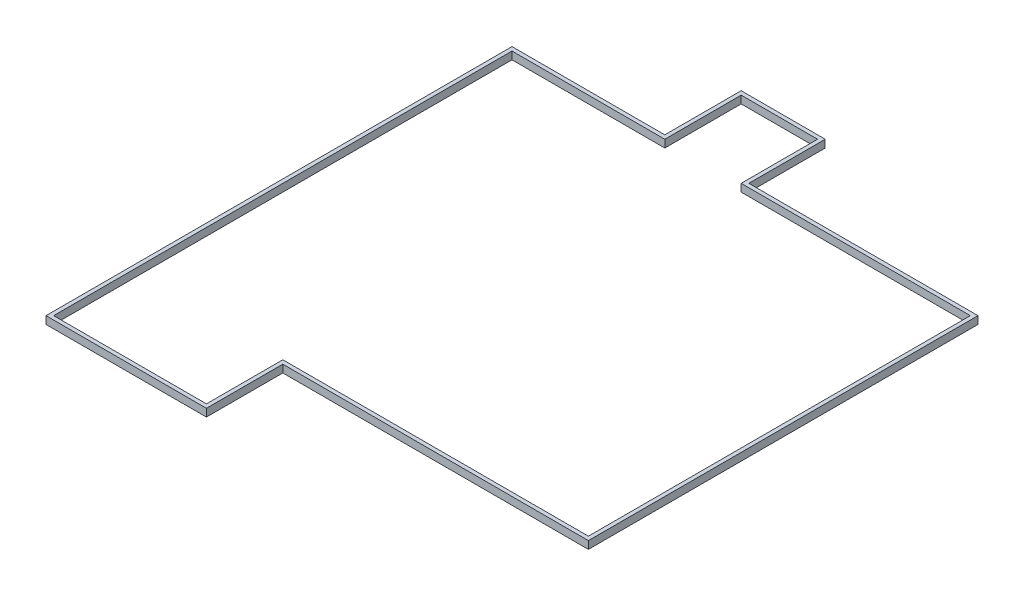
ISO-10303-21;
HEADER;
FILE_DESCRIPTION(('STEP AP214'),'2;1');
FILE_NAME('part.step','',(''),(''),'','','');
FILE_SCHEMA(('AUTOMOTIVE_DESIGN { 1 0 10303 214 1 1 1 1 }'));
ENDSEC;
DATA;
#1=APPLICATION_CONTEXT('core data for automotive mechanical design processes');
#2=APPLICATION_PROTOCOL_DEFINITION('international standard','automotive_design',2000,#1);
#3=PRODUCT_CONTEXT('',#1,'mechanical');
#4=PRODUCT('Part','Part','',(#3));
#5=PRODUCT_RELATED_PRODUCT_CATEGORY('part','',(#4));
#6=PRODUCT_DEFINITION_FORMATION('','',#4);
#7=PRODUCT_DEFINITION_CONTEXT('part definition',#1,'design');
#8=PRODUCT_DEFINITION('design','',#6,#7);
#9=PRODUCT_DEFINITION_SHAPE('','',#8);
#10=(LENGTH_UNIT() NAMED_UNIT(*) SI_UNIT(.MILLI.,.METRE.));
#11=(NAMED_UNIT(*) PLANE_ANGLE_UNIT() SI_UNIT($,.RADIAN.));
#12=(NAMED_UNIT(*) SI_UNIT($,.STERADIAN.) SOLID_ANGLE_UNIT());
#13=UNCERTAINTY_MEASURE_WITH_UNIT(LENGTH_MEASURE(1.E-05),#10,'distance_accuracy_value','');
#14=(GEOMETRIC_REPRESENTATION_CONTEXT(3) GLOBAL_UNCERTAINTY_ASSIGNED_CONTEXT((#13)) GLOBAL_UNIT_ASSIGNED_CONTEXT((#10,
#11,#12)) REPRESENTATION_CONTEXT('',''));
#15=CARTESIAN_POINT('',(0.,0.,0.));
#16=DIRECTION('',(0.,0.,1.));
#17=DIRECTION('',(1.,0.,0.));
#18=AXIS2_PLACEMENT_3D('',#15,#16,#17);
#19=CARTESIAN_POINT('',(0.,80.,0.));
#20=DIRECTION('',(0.,-1.,0.));
#21=DIRECTION('',(0.,0.,-1.));
#22=AXIS2_PLACEMENT_3D('',#19,#20,#21);
#23=PLANE('',#22);
#24=DIRECTION('',(0.,0.,1.));
#25=VECTOR('',#24,1.);
#26=CARTESIAN_POINT('',(-839.999999999999,80.,-3640.));
#27=LINE('',#26,#25);
#28=CARTESIAN_POINT('',(-839.999999999999,80.,-3640.));
#29=VERTEX_POINT('',#28);
#30=CARTESIAN_POINT('',(-839.999999999999,80.,-2840.));
#31=VERTEX_POINT('',#30);
#32=EDGE_CURVE('E252',#29,#31,#27,.T.);
#33=ORIENTED_EDGE('',*,*,#32,.T.);
#34=DIRECTION('',(-1.,0.,0.));
#35=VECTOR('',#34,1.);
#36=CARTESIAN_POINT('',(-839.999999999999,80.,-2840.));
#37=LINE('',#36,#35);
#38=CARTESIAN_POINT('',(-2440.,80.,-2840.));
#39=VERTEX_POINT('',#38);
#40=EDGE_CURVE('E255',#31,#39,#37,.T.);
#41=ORIENTED_EDGE('',*,*,#40,.T.);
#42=DIRECTION('',(0.,0.,1.));
#43=VECTOR('',#42,1.);
#44=CARTESIAN_POINT('',(-2440.,80.,-2840.));
#45=LINE('',#44,#43);
#46=CARTESIAN_POINT('',(-2440.,80.,2040.));
#47=VERTEX_POINT('',#46);
#48=EDGE_CURVE('E258',#39,#47,#45,.T.);
#49=ORIENTED_EDGE('',*,*,#48,.T.);
#50=DIRECTION('',(1.,0.,0.));
#51=VECTOR('',#50,1.);
#52=CARTESIAN_POINT('',(-2440.,80.,2040.));
#53=LINE('',#52,#51);
#54=CARTESIAN_POINT('',(-759.999999999999,80.,2040.));
#55=VERTEX_POINT('',#54);
#56=EDGE_CURVE('E260',#47,#55,#53,.T.);
#57=ORIENTED_EDGE('',*,*,#56,.T.);
#58=DIRECTION('',(0.,0.,-1.));
#59=VECTOR('',#58,1.);
#60=CARTESIAN_POINT('',(-759.999999999999,80.,1240.));
#61=LINE('',#60,#59);
#62=CARTESIAN_POINT('',(-759.999999999999,80.,1240.));
#63=VERTEX_POINT('',#62);
#64=EDGE_CURVE('E262',#55,#63,#61,.T.);
#65=ORIENTED_EDGE('',*,*,#64,.T.);
#66=DIRECTION('',(1.,0.,0.));
#67=VECTOR('',#66,1.);
#68=CARTESIAN_POINT('',(-759.999999999999,80.,1240.));
#69=LINE('',#68,#67);
#70=CARTESIAN_POINT('',(2440.00000000003,80.,1240.));
#71=VERTEX_POINT('',#70);
#72=EDGE_CURVE('E264',#63,#71,#69,.T.);
#73=ORIENTED_EDGE('',*,*,#72,.T.);
#74=DIRECTION('',(0.,0.,-1.));
#75=VECTOR('',#74,1.);
#76=CARTESIAN_POINT('',(2440.00000000003,80.,1240.));
#77=LINE('',#76,#75);
#78=CARTESIAN_POINT('',(2440.00000000003,80.,-2840.));
#79=VERTEX_POINT('',#78);
#80=EDGE_CURVE('E266',#71,#79,#77,.T.);
#81=ORIENTED_EDGE('',*,*,#80,.T.);
#82=DIRECTION('',(-1.,0.,0.));
#83=VECTOR('',#82,1.);
#84=CARTESIAN_POINT('',(2440.00000000003,80.,-2840.));
#85=LINE('',#84,#83);
#86=CARTESIAN_POINT('',(40.,80.,-2840.));
#87=VERTEX_POINT('',#86);
#88=EDGE_CURVE('E268',#79,#87,#85,.T.);
#89=ORIENTED_EDGE('',*,*,#88,.T.);
#90=DIRECTION('',(0.,0.,-1.));
#91=VECTOR('',#90,1.);
#92=CARTESIAN_POINT('',(40.,80.,-2840.));
#93=LINE('',#92,#91);
#94=CARTESIAN_POINT('',(40.,80.,-3640.));
#95=VERTEX_POINT('',#94);
#96=EDGE_CURVE('E270',#87,#95,#93,.T.);
#97=ORIENTED_EDGE('',*,*,#96,.T.);
#98=DIRECTION('',(-1.,0.,0.));
#99=VECTOR('',#98,1.);
#100=CARTESIAN_POINT('',(40.,80.,-3640.));
#101=LINE('',#100,#99);
#102=EDGE_CURVE('E272',#95,#29,#101,.T.);
#103=ORIENTED_EDGE('',*,*,#102,.T.);
#104=EDGE_LOOP('',(#33,#41,#49,#57,#65,#73,#81,#89,#97,#103));
#105=FACE_BOUND('',#104,.T.);
#106=DIRECTION('',(0.,0.,1.));
#107=VECTOR('',#106,1.);
#108=CARTESIAN_POINT('',(-799.999999999999,80.,-3600.));
#109=LINE('',#108,#107);
#110=CARTESIAN_POINT('',(-799.999999999999,80.,-3600.));
#111=VERTEX_POINT('',#110);
#112=CARTESIAN_POINT('',(-799.999999999999,80.,-2800.));
#113=VERTEX_POINT('',#112);
#114=EDGE_CURVE('E173',#111,#113,#109,.T.);
#115=ORIENTED_EDGE('',*,*,#114,.F.);
#116=DIRECTION('',(-1.,0.,0.));
#117=VECTOR('',#116,1.);
#118=CARTESIAN_POINT('',(0.,80.,-3600.));
#119=LINE('',#118,#117);
#120=CARTESIAN_POINT('',(0.,80.,-3600.));
#121=VERTEX_POINT('',#120);
#122=EDGE_CURVE('E210',#121,#111,#119,.T.);
#123=ORIENTED_EDGE('',*,*,#122,.F.);
#124=DIRECTION('',(0.,0.,-1.));
#125=VECTOR('',#124,1.);
#126=CARTESIAN_POINT('',(0.,80.,-2800.));
#127=LINE('',#126,#125);
#128=CARTESIAN_POINT('',(0.,80.,-2800.));
#129=VERTEX_POINT('',#128);
#130=EDGE_CURVE('E208',#129,#121,#127,.T.);
#131=ORIENTED_EDGE('',*,*,#130,.F.);
#132=DIRECTION('',(-1.,0.,0.));
#133=VECTOR('',#132,1.);
#134=CARTESIAN_POINT('',(2400.,80.,-2800.));
#135=LINE('',#134,#133);
#136=CARTESIAN_POINT('',(2400.,80.,-2800.));
#137=VERTEX_POINT('',#136);
#138=EDGE_CURVE('E206',#137,#129,#135,.T.);
#139=ORIENTED_EDGE('',*,*,#138,.F.);
#140=DIRECTION('',(0.,0.,-1.));
#141=VECTOR('',#140,1.);
#142=CARTESIAN_POINT('',(2400.00000000003,80.,1200.));
#143=LINE('',#142,#141);
#144=CARTESIAN_POINT('',(2400.00000000003,80.,1200.));
#145=VERTEX_POINT('',#144);
#146=EDGE_CURVE('E204',#145,#137,#143,.T.);
#147=ORIENTED_EDGE('',*,*,#146,.F.);
#148=DIRECTION('',(1.,0.,0.));
#149=VECTOR('',#148,1.);
#150=CARTESIAN_POINT('',(-799.999999999999,80.,1200.));
#151=LINE('',#150,#149);
#152=CARTESIAN_POINT('',(-799.999999999999,80.,1200.));
#153=VERTEX_POINT('',#152);
#154=EDGE_CURVE('E202',#153,#145,#151,.T.);
#155=ORIENTED_EDGE('',*,*,#154,.F.);
#156=DIRECTION('',(0.,0.,-1.));
#157=VECTOR('',#156,1.);
#158=CARTESIAN_POINT('',(-799.999999999999,80.,2000.));
#159=LINE('',#158,#157);
#160=CARTESIAN_POINT('',(-799.999999999999,80.,2000.));
#161=VERTEX_POINT('',#160);
#162=EDGE_CURVE('E200',#161,#153,#159,.T.);
#163=ORIENTED_EDGE('',*,*,#162,.F.);
#164=DIRECTION('',(1.,0.,0.));
#165=VECTOR('',#164,1.);
#166=CARTESIAN_POINT('',(-2399.99999999996,80.,2000.));
#167=LINE('',#166,#165);
#168=CARTESIAN_POINT('',(-2399.99999999996,80.,2000.));
#169=VERTEX_POINT('',#168);
#170=EDGE_CURVE('E196',#169,#161,#167,.T.);
#171=ORIENTED_EDGE('',*,*,#170,.F.);
#172=DIRECTION('',(0.,0.,1.));
#173=VECTOR('',#172,1.);
#174=CARTESIAN_POINT('',(-2400.,80.,-2800.));
#175=LINE('',#174,#173);
#176=CARTESIAN_POINT('',(-2400.,80.,-2800.));
#177=VERTEX_POINT('',#176);
#178=EDGE_CURVE('E194',#177,#169,#175,.T.);
#179=ORIENTED_EDGE('',*,*,#178,.F.);
#180=DIRECTION('',(-1.,0.,0.));
#181=VECTOR('',#180,1.);
#182=CARTESIAN_POINT('',(-799.999999999999,80.,-2800.));
#183=LINE('',#182,#181);
#184=EDGE_CURVE('E181',#113,#177,#183,.T.);
#185=ORIENTED_EDGE('',*,*,#184,.F.);
#186=EDGE_LOOP('',(#115,#123,#131,#139,#147,#155,#163,#171,#179,#185));
#187=FACE_BOUND('',#186,.T.);
#188=ADVANCED_FACE('F36',(#105,#187),#23,.F.);
#189=CARTESIAN_POINT('',(0.,0.,0.));
#190=DIRECTION('',(0.,-1.,0.));
#191=DIRECTION('',(0.,0.,-1.));
#192=AXIS2_PLACEMENT_3D('',#189,#190,#191);
#193=PLANE('',#192);
#194=DIRECTION('',(0.,0.,1.));
#195=VECTOR('',#194,1.);
#196=CARTESIAN_POINT('',(-839.999999999999,0.,-3640.));
#197=LINE('',#196,#195);
#198=CARTESIAN_POINT('',(-839.999999999999,0.,-3640.));
#199=VERTEX_POINT('',#198);
#200=CARTESIAN_POINT('',(-839.999999999999,0.,-2840.));
#201=VERTEX_POINT('',#200);
#202=EDGE_CURVE('E189',#199,#201,#197,.T.);
#203=ORIENTED_EDGE('',*,*,#202,.F.);
#204=DIRECTION('',(-1.,0.,0.));
#205=VECTOR('',#204,1.);
#206=CARTESIAN_POINT('',(40.,0.,-3640.));
#207=LINE('',#206,#205);
#208=CARTESIAN_POINT('',(40.,0.,-3640.));
#209=VERTEX_POINT('',#208);
#210=EDGE_CURVE('E256',#209,#199,#207,.T.);
#211=ORIENTED_EDGE('',*,*,#210,.F.);
#212=DIRECTION('',(0.,0.,-1.));
#213=VECTOR('',#212,1.);
#214=CARTESIAN_POINT('',(40.,0.,-2840.));
#215=LINE('',#214,#213);
#216=CARTESIAN_POINT('',(40.,0.,-2840.));
#217=VERTEX_POINT('',#216);
#218=EDGE_CURVE('E291',#217,#209,#215,.T.);
#219=ORIENTED_EDGE('',*,*,#218,.F.);
#220=DIRECTION('',(-1.,0.,0.));
#221=VECTOR('',#220,1.);
#222=CARTESIAN_POINT('',(2440.00000000003,0.,-2840.));
#223=LINE('',#222,#221);
#224=CARTESIAN_POINT('',(2440.00000000003,0.,-2840.));
#225=VERTEX_POINT('',#224);
#226=EDGE_CURVE('E289',#225,#217,#223,.T.);
#227=ORIENTED_EDGE('',*,*,#226,.F.);
#228=DIRECTION('',(0.,0.,-1.));
#229=VECTOR('',#228,1.);
#230=CARTESIAN_POINT('',(2440.00000000003,0.,1240.));
#231=LINE('',#230,#229);
#232=CARTESIAN_POINT('',(2440.00000000003,0.,1240.));
#233=VERTEX_POINT('',#232);
#234=EDGE_CURVE('E287',#233,#225,#231,.T.);
#235=ORIENTED_EDGE('',*,*,#234,.F.);
#236=DIRECTION('',(1.,0.,0.));
#237=VECTOR('',#236,1.);
#238=CARTESIAN_POINT('',(-759.999999999999,0.,1240.));
#239=LINE('',#238,#237);
#240=CARTESIAN_POINT('',(-759.999999999999,0.,1240.));
#241=VERTEX_POINT('',#240);
#242=EDGE_CURVE('E285',#241,#233,#239,.T.);
#243=ORIENTED_EDGE('',*,*,#242,.F.);
#244=DIRECTION('',(0.,0.,-1.));
#245=VECTOR('',#244,1.);
#246=CARTESIAN_POINT('',(-759.999999999999,0.,1240.));
#247=LINE('',#246,#245);
#248=CARTESIAN_POINT('',(-759.999999999999,0.,2040.));
#249=VERTEX_POINT('',#248);
#250=EDGE_CURVE('E283',#249,#241,#247,.T.);
#251=ORIENTED_EDGE('',*,*,#250,.F.);
#252=DIRECTION('',(1.,0.,0.));
#253=VECTOR('',#252,1.);
#254=CARTESIAN_POINT('',(-2440.,0.,2040.));
#255=LINE('',#254,#253);
#256=CARTESIAN_POINT('',(-2440.,0.,2040.));
#257=VERTEX_POINT('',#256);
#258=EDGE_CURVE('E281',#257,#249,#255,.T.);
#259=ORIENTED_EDGE('',*,*,#258,.F.);
#260=DIRECTION('',(0.,0.,1.));
#261=VECTOR('',#260,1.);
#262=CARTESIAN_POINT('',(-2440.,0.,-2840.));
#263=LINE('',#262,#261);
#264=CARTESIAN_POINT('',(-2440.,0.,-2840.));
#265=VERTEX_POINT('',#264);
#266=EDGE_CURVE('E279',#265,#257,#263,.T.);
#267=ORIENTED_EDGE('',*,*,#266,.F.);
#268=DIRECTION('',(-1.,0.,0.));
#269=VECTOR('',#268,1.);
#270=CARTESIAN_POINT('',(-839.999999999999,0.,-2840.));
#271=LINE('',#270,#269);
#272=EDGE_CURVE('E277',#201,#265,#271,.T.);
#273=ORIENTED_EDGE('',*,*,#272,.F.);
#274=EDGE_LOOP('',(#203,#211,#219,#227,#235,#243,#251,#259,#267,#273));
#275=FACE_BOUND('',#274,.T.);
#276=DIRECTION('',(-1.,0.,0.));
#277=VECTOR('',#276,1.);
#278=CARTESIAN_POINT('',(0.,0.,-3600.));
#279=LINE('',#278,#277);
#280=CARTESIAN_POINT('',(0.,0.,-3600.));
#281=VERTEX_POINT('',#280);
#282=CARTESIAN_POINT('',(-799.999999999999,0.,-3600.));
#283=VERTEX_POINT('',#282);
#284=EDGE_CURVE('E182',#281,#283,#279,.T.);
#285=ORIENTED_EDGE('',*,*,#284,.T.);
#286=DIRECTION('',(0.,0.,1.));
#287=VECTOR('',#286,1.);
#288=CARTESIAN_POINT('',(-799.999999999999,0.,-3600.));
#289=LINE('',#288,#287);
#290=CARTESIAN_POINT('',(-799.999999999999,0.,-2800.));
#291=VERTEX_POINT('',#290);
#292=EDGE_CURVE('E59',#283,#291,#289,.T.);
#293=ORIENTED_EDGE('',*,*,#292,.T.);
#294=DIRECTION('',(-1.,0.,0.));
#295=VECTOR('',#294,1.);
#296=CARTESIAN_POINT('',(-799.999999999999,0.,-2800.));
#297=LINE('',#296,#295);
#298=CARTESIAN_POINT('',(-2400.,0.,-2800.));
#299=VERTEX_POINT('',#298);
#300=EDGE_CURVE('E188',#291,#299,#297,.T.);
#301=ORIENTED_EDGE('',*,*,#300,.T.);
#302=DIRECTION('',(0.,0.,1.));
#303=VECTOR('',#302,1.);
#304=CARTESIAN_POINT('',(-2400.,0.,-2800.));
#305=LINE('',#304,#303);
#306=CARTESIAN_POINT('',(-2399.99999999996,0.,2000.));
#307=VERTEX_POINT('',#306);
#308=EDGE_CURVE('E214',#299,#307,#305,.T.);
#309=ORIENTED_EDGE('',*,*,#308,.T.);
#310=DIRECTION('',(1.,0.,0.));
#311=VECTOR('',#310,1.);
#312=CARTESIAN_POINT('',(-2399.99999999996,0.,2000.));
#313=LINE('',#312,#311);
#314=CARTESIAN_POINT('',(-799.999999999999,0.,2000.));
#315=VERTEX_POINT('',#314);
#316=EDGE_CURVE('E217',#307,#315,#313,.T.);
#317=ORIENTED_EDGE('',*,*,#316,.T.);
#318=DIRECTION('',(0.,0.,-1.));
#319=VECTOR('',#318,1.);
#320=CARTESIAN_POINT('',(-799.999999999999,0.,2000.));
#321=LINE('',#320,#319);
#322=CARTESIAN_POINT('',(-799.999999999999,0.,1200.));
#323=VERTEX_POINT('',#322);
#324=EDGE_CURVE('E220',#315,#323,#321,.T.);
#325=ORIENTED_EDGE('',*,*,#324,.T.);
#326=DIRECTION('',(1.,0.,0.));
#327=VECTOR('',#326,1.);
#328=CARTESIAN_POINT('',(-799.999999999999,0.,1200.));
#329=LINE('',#328,#327);
#330=CARTESIAN_POINT('',(2400.00000000003,0.,1200.));
#331=VERTEX_POINT('',#330);
#332=EDGE_CURVE('E223',#323,#331,#329,.T.);
#333=ORIENTED_EDGE('',*,*,#332,.T.);
#334=DIRECTION('',(0.,0.,-1.));
#335=VECTOR('',#334,1.);
#336=CARTESIAN_POINT('',(2400.00000000003,0.,1200.));
#337=LINE('',#336,#335);
#338=CARTESIAN_POINT('',(2400.,0.,-2800.));
#339=VERTEX_POINT('',#338);
#340=EDGE_CURVE('E226',#331,#339,#337,.T.);
#341=ORIENTED_EDGE('',*,*,#340,.T.);
#342=DIRECTION('',(-1.,0.,0.));
#343=VECTOR('',#342,1.);
#344=CARTESIAN_POINT('',(2400.,0.,-2800.));
#345=LINE('',#344,#343);
#346=CARTESIAN_POINT('',(0.,0.,-2800.));
#347=VERTEX_POINT('',#346);
#348=EDGE_CURVE('E229',#339,#347,#345,.T.);
#349=ORIENTED_EDGE('',*,*,#348,.T.);
#350=DIRECTION('',(0.,0.,-1.));
#351=VECTOR('',#350,1.);
#352=CARTESIAN_POINT('',(0.,0.,-2800.));
#353=LINE('',#352,#351);
#354=EDGE_CURVE('E232',#347,#281,#353,.T.);
#355=ORIENTED_EDGE('',*,*,#354,.T.);
#356=EDGE_LOOP('',(#285,#293,#301,#309,#317,#325,#333,#341,#349,#355));
#357=FACE_BOUND('',#356,.T.);
#358=ADVANCED_FACE('F327',(#275,#357),#193,.T.);
#359=CARTESIAN_POINT('',(-839.999999999999,80.,-3640.));
#360=DIRECTION('',(1.,0.,0.));
#361=DIRECTION('',(0.,0.,-1.));
#362=AXIS2_PLACEMENT_3D('',#359,#360,#361);
#363=PLANE('',#362);
#364=ORIENTED_EDGE('',*,*,#202,.T.);
#365=DIRECTION('',(0.,-1.,0.));
#366=VECTOR('',#365,1.);
#367=CARTESIAN_POINT('',(-839.999999999999,80.,-2840.));
#368=LINE('',#367,#366);
#369=EDGE_CURVE('E11',#31,#201,#368,.T.);
#370=ORIENTED_EDGE('',*,*,#369,.F.);
#371=ORIENTED_EDGE('',*,*,#32,.F.);
#372=DIRECTION('',(0.,-1.,0.));
#373=VECTOR('',#372,1.);
#374=CARTESIAN_POINT('',(-839.999999999999,80.,-3640.));
#375=LINE('',#374,#373);
#376=EDGE_CURVE('E274',#29,#199,#375,.T.);
#377=ORIENTED_EDGE('',*,*,#376,.T.);
#378=EDGE_LOOP('',(#364,#370,#371,#377));
#379=FACE_BOUND('',#378,.T.);
#380=ADVANCED_FACE('F38',(#379),#363,.F.);
#381=CARTESIAN_POINT('',(-839.999999999999,80.,-2840.));
#382=DIRECTION('',(0.,0.,1.));
#383=DIRECTION('',(1.,0.,0.));
#384=AXIS2_PLACEMENT_3D('',#381,#382,#383);
#385=PLANE('',#384);
#386=ORIENTED_EDGE('',*,*,#272,.T.);
#387=DIRECTION('',(0.,-1.,0.));
#388=VECTOR('',#387,1.);
#389=CARTESIAN_POINT('',(-2440.,80.,-2840.));
#390=LINE('',#389,#388);
#391=EDGE_CURVE('E44',#39,#265,#390,.T.);
#392=ORIENTED_EDGE('',*,*,#391,.F.);
#393=ORIENTED_EDGE('',*,*,#40,.F.);
#394=ORIENTED_EDGE('',*,*,#369,.T.);
#395=EDGE_LOOP('',(#386,#392,#393,#394));
#396=FACE_BOUND('',#395,.T.);
#397=ADVANCED_FACE('F344',(#396),#385,.F.);
#398=CARTESIAN_POINT('',(-2440.,80.,-2840.));
#399=DIRECTION('',(1.,0.,0.));
#400=DIRECTION('',(0.,0.,-1.));
#401=AXIS2_PLACEMENT_3D('',#398,#399,#400);
#402=PLANE('',#401);
#403=ORIENTED_EDGE('',*,*,#266,.T.);
#404=DIRECTION('',(0.,-1.,0.));
#405=VECTOR('',#404,1.);
#406=CARTESIAN_POINT('',(-2440.,80.,2040.));
#407=LINE('',#406,#405);
#408=EDGE_CURVE('E314',#47,#257,#407,.T.);
#409=ORIENTED_EDGE('',*,*,#408,.F.);
#410=ORIENTED_EDGE('',*,*,#48,.F.);
#411=ORIENTED_EDGE('',*,*,#391,.T.);
#412=EDGE_LOOP('',(#403,#409,#410,#411));
#413=FACE_BOUND('',#412,.T.);
#414=ADVANCED_FACE('F321',(#413),#402,.F.);
#415=CARTESIAN_POINT('',(-2440.,80.,2040.));
#416=DIRECTION('',(0.,0.,-1.));
#417=DIRECTION('',(-1.,0.,0.));
#418=AXIS2_PLACEMENT_3D('',#415,#416,#417);
#419=PLANE('',#418);
#420=ORIENTED_EDGE('',*,*,#258,.T.);
#421=DIRECTION('',(0.,-1.,0.));
#422=VECTOR('',#421,1.);
#423=CARTESIAN_POINT('',(-759.999999999999,80.,2040.));
#424=LINE('',#423,#422);
#425=EDGE_CURVE('E311',#55,#249,#424,.T.);
#426=ORIENTED_EDGE('',*,*,#425,.F.);
#427=ORIENTED_EDGE('',*,*,#56,.F.);
#428=ORIENTED_EDGE('',*,*,#408,.T.);
#429=EDGE_LOOP('',(#420,#426,#427,#428));
#430=FACE_BOUND('',#429,.T.);
#431=ADVANCED_FACE('F333',(#430),#419,.F.);
#432=CARTESIAN_POINT('',(-759.999999999999,80.,1240.));
#433=DIRECTION('',(-1.,0.,0.));
#434=DIRECTION('',(0.,0.,1.));
#435=AXIS2_PLACEMENT_3D('',#432,#433,#434);
#436=PLANE('',#435);
#437=ORIENTED_EDGE('',*,*,#250,.T.);
#438=DIRECTION('',(0.,-1.,0.));
#439=VECTOR('',#438,1.);
#440=CARTESIAN_POINT('',(-759.999999999999,80.,1240.));
#441=LINE('',#440,#439);
#442=EDGE_CURVE('E308',#63,#241,#441,.T.);
#443=ORIENTED_EDGE('',*,*,#442,.F.);
#444=ORIENTED_EDGE('',*,*,#64,.F.);
#445=ORIENTED_EDGE('',*,*,#425,.T.);
#446=EDGE_LOOP('',(#437,#443,#444,#445));
#447=FACE_BOUND('',#446,.T.);
#448=ADVANCED_FACE('F337',(#447),#436,.F.);
#449=CARTESIAN_POINT('',(-759.999999999999,80.,1240.));
#450=DIRECTION('',(0.,0.,-1.));
#451=DIRECTION('',(-1.,0.,0.));
#452=AXIS2_PLACEMENT_3D('',#449,#450,#451);
#453=PLANE('',#452);
#454=ORIENTED_EDGE('',*,*,#242,.T.);
#455=DIRECTION('',(0.,-1.,0.));
#456=VECTOR('',#455,1.);
#457=CARTESIAN_POINT('',(2440.00000000003,80.,1240.));
#458=LINE('',#457,#456);
#459=EDGE_CURVE('E305',#71,#233,#458,.T.);
#460=ORIENTED_EDGE('',*,*,#459,.F.);
#461=ORIENTED_EDGE('',*,*,#72,.F.);
#462=ORIENTED_EDGE('',*,*,#442,.T.);
#463=EDGE_LOOP('',(#454,#460,#461,#462));
#464=FACE_BOUND('',#463,.T.);
#465=ADVANCED_FACE('F367',(#464),#453,.F.);
#466=CARTESIAN_POINT('',(2440.00000000003,80.,1240.));
#467=DIRECTION('',(-1.,0.,0.));
#468=DIRECTION('',(0.,0.,1.));
#469=AXIS2_PLACEMENT_3D('',#466,#467,#468);
#470=PLANE('',#469);
#471=ORIENTED_EDGE('',*,*,#234,.T.);
#472=DIRECTION('',(0.,-1.,0.));
#473=VECTOR('',#472,1.);
#474=CARTESIAN_POINT('',(2440.00000000003,80.,-2840.));
#475=LINE('',#474,#473);
#476=EDGE_CURVE('E302',#79,#225,#475,.T.);
#477=ORIENTED_EDGE('',*,*,#476,.F.);
#478=ORIENTED_EDGE('',*,*,#80,.F.);
#479=ORIENTED_EDGE('',*,*,#459,.T.);
#480=EDGE_LOOP('',(#471,#477,#478,#479));
#481=FACE_BOUND('',#480,.T.);
#482=ADVANCED_FACE('F364',(#481),#470,.F.);
#483=CARTESIAN_POINT('',(2440.00000000003,80.,-2840.));
#484=DIRECTION('',(0.,0.,1.));
#485=DIRECTION('',(1.,0.,0.));
#486=AXIS2_PLACEMENT_3D('',#483,#484,#485);
#487=PLANE('',#486);
#488=ORIENTED_EDGE('',*,*,#226,.T.);
#489=DIRECTION('',(0.,-1.,0.));
#490=VECTOR('',#489,1.);
#491=CARTESIAN_POINT('',(40.,80.,-2840.));
#492=LINE('',#491,#490);
#493=EDGE_CURVE('E299',#87,#217,#492,.T.);
#494=ORIENTED_EDGE('',*,*,#493,.F.);
#495=ORIENTED_EDGE('',*,*,#88,.F.);
#496=ORIENTED_EDGE('',*,*,#476,.T.);
#497=EDGE_LOOP('',(#488,#494,#495,#496));
#498=FACE_BOUND('',#497,.T.);
#499=ADVANCED_FACE('F360',(#498),#487,.F.);
#500=CARTESIAN_POINT('',(40.,80.,-2840.));
#501=DIRECTION('',(-1.,0.,0.));
#502=DIRECTION('',(0.,0.,1.));
#503=AXIS2_PLACEMENT_3D('',#500,#501,#502);
#504=PLANE('',#503);
#505=ORIENTED_EDGE('',*,*,#218,.T.);
#506=DIRECTION('',(0.,-1.,0.));
#507=VECTOR('',#506,1.);
#508=CARTESIAN_POINT('',(40.,80.,-3640.));
#509=LINE('',#508,#507);
#510=EDGE_CURVE('E296',#95,#209,#509,.T.);
#511=ORIENTED_EDGE('',*,*,#510,.F.);
#512=ORIENTED_EDGE('',*,*,#96,.F.);
#513=ORIENTED_EDGE('',*,*,#493,.T.);
#514=EDGE_LOOP('',(#505,#511,#512,#513));
#515=FACE_BOUND('',#514,.T.);
#516=ADVANCED_FACE('F356',(#515),#504,.F.);
#517=CARTESIAN_POINT('',(40.,80.,-3640.));
#518=DIRECTION('',(0.,0.,1.));
#519=DIRECTION('',(1.,0.,0.));
#520=AXIS2_PLACEMENT_3D('',#517,#518,#519);
#521=PLANE('',#520);
#522=ORIENTED_EDGE('',*,*,#210,.T.);
#523=ORIENTED_EDGE('',*,*,#376,.F.);
#524=ORIENTED_EDGE('',*,*,#102,.F.);
#525=ORIENTED_EDGE('',*,*,#510,.T.);
#526=EDGE_LOOP('',(#522,#523,#524,#525));
#527=FACE_BOUND('',#526,.T.);
#528=ADVANCED_FACE('F351',(#527),#521,.F.);
#529=CARTESIAN_POINT('',(-799.999999999999,80.,-3600.));
#530=DIRECTION('',(1.,0.,0.));
#531=DIRECTION('',(0.,0.,-1.));
#532=AXIS2_PLACEMENT_3D('',#529,#530,#531);
#533=PLANE('',#532);
#534=ORIENTED_EDGE('',*,*,#292,.F.);
#535=DIRECTION('',(0.,-1.,0.));
#536=VECTOR('',#535,1.);
#537=CARTESIAN_POINT('',(-799.999999999999,80.,-3600.));
#538=LINE('',#537,#536);
#539=EDGE_CURVE('E177',#111,#283,#538,.T.);
#540=ORIENTED_EDGE('',*,*,#539,.F.);
#541=ORIENTED_EDGE('',*,*,#114,.T.);
#542=DIRECTION('',(0.,-1.,0.));
#543=VECTOR('',#542,1.);
#544=CARTESIAN_POINT('',(-799.999999999999,80.,-2800.));
#545=LINE('',#544,#543);
#546=EDGE_CURVE('E176',#113,#291,#545,.T.);
#547=ORIENTED_EDGE('',*,*,#546,.T.);
#548=EDGE_LOOP('',(#534,#540,#541,#547));
#549=FACE_BOUND('',#548,.T.);
#550=ADVANCED_FACE('F175',(#549),#533,.T.);
#551=CARTESIAN_POINT('',(-799.999999999999,80.,-2800.));
#552=DIRECTION('',(0.,0.,1.));
#553=DIRECTION('',(1.,0.,0.));
#554=AXIS2_PLACEMENT_3D('',#551,#552,#553);
#555=PLANE('',#554);
#556=ORIENTED_EDGE('',*,*,#300,.F.);
#557=ORIENTED_EDGE('',*,*,#546,.F.);
#558=ORIENTED_EDGE('',*,*,#184,.T.);
#559=DIRECTION('',(0.,-1.,0.));
#560=VECTOR('',#559,1.);
#561=CARTESIAN_POINT('',(-2400.,80.,-2800.));
#562=LINE('',#561,#560);
#563=EDGE_CURVE('E190',#177,#299,#562,.T.);
#564=ORIENTED_EDGE('',*,*,#563,.T.);
#565=EDGE_LOOP('',(#556,#557,#558,#564));
#566=FACE_BOUND('',#565,.T.);
#567=ADVANCED_FACE('F185',(#566),#555,.T.);
#568=CARTESIAN_POINT('',(-2400.,80.,-2800.));
#569=DIRECTION('',(1.,0.,0.));
#570=DIRECTION('',(0.,0.,-1.));
#571=AXIS2_PLACEMENT_3D('',#568,#569,#570);
#572=PLANE('',#571);
#573=ORIENTED_EDGE('',*,*,#308,.F.);
#574=ORIENTED_EDGE('',*,*,#563,.F.);
#575=ORIENTED_EDGE('',*,*,#178,.T.);
#576=DIRECTION('',(0.,-1.,0.));
#577=VECTOR('',#576,1.);
#578=CARTESIAN_POINT('',(-2399.99999999996,80.,2000.));
#579=LINE('',#578,#577);
#580=EDGE_CURVE('E249',#169,#307,#579,.T.);
#581=ORIENTED_EDGE('',*,*,#580,.T.);
#582=EDGE_LOOP('',(#573,#574,#575,#581));
#583=FACE_BOUND('',#582,.T.);
#584=ADVANCED_FACE('F413',(#583),#572,.T.);
#585=CARTESIAN_POINT('',(-2399.99999999996,80.,2000.));
#586=DIRECTION('',(0.,0.,-1.));
#587=DIRECTION('',(-1.,0.,0.));
#588=AXIS2_PLACEMENT_3D('',#585,#586,#587);
#589=PLANE('',#588);
#590=ORIENTED_EDGE('',*,*,#316,.F.);
#591=ORIENTED_EDGE('',*,*,#580,.F.);
#592=ORIENTED_EDGE('',*,*,#170,.T.);
#593=DIRECTION('',(0.,-1.,0.));
#594=VECTOR('',#593,1.);
#595=CARTESIAN_POINT('',(-799.999999999999,80.,2000.));
#596=LINE('',#595,#594);
#597=EDGE_CURVE('E247',#161,#315,#596,.T.);
#598=ORIENTED_EDGE('',*,*,#597,.T.);
#599=EDGE_LOOP('',(#590,#591,#592,#598));
#600=FACE_BOUND('',#599,.T.);
#601=ADVANCED_FACE('F419',(#600),#589,.T.);
#602=CARTESIAN_POINT('',(-799.999999999999,80.,2000.));
#603=DIRECTION('',(-1.,0.,0.));
#604=DIRECTION('',(0.,0.,1.));
#605=AXIS2_PLACEMENT_3D('',#602,#603,#604);
#606=PLANE('',#605);
#607=ORIENTED_EDGE('',*,*,#324,.F.);
#608=ORIENTED_EDGE('',*,*,#597,.F.);
#609=ORIENTED_EDGE('',*,*,#162,.T.);
#610=DIRECTION('',(0.,-1.,0.));
#611=VECTOR('',#610,1.);
#612=CARTESIAN_POINT('',(-799.999999999999,80.,1200.));
#613=LINE('',#612,#611);
#614=EDGE_CURVE('E245',#153,#323,#613,.T.);
#615=ORIENTED_EDGE('',*,*,#614,.T.);
#616=EDGE_LOOP('',(#607,#608,#609,#615));
#617=FACE_BOUND('',#616,.T.);
#618=ADVANCED_FACE('F427',(#617),#606,.T.);
#619=CARTESIAN_POINT('',(-799.999999999999,80.,1200.));
#620=DIRECTION('',(0.,0.,-1.));
#621=DIRECTION('',(-1.,0.,0.));
#622=AXIS2_PLACEMENT_3D('',#619,#620,#621);
#623=PLANE('',#622);
#624=ORIENTED_EDGE('',*,*,#332,.F.);
#625=ORIENTED_EDGE('',*,*,#614,.F.);
#626=ORIENTED_EDGE('',*,*,#154,.T.);
#627=DIRECTION('',(0.,-1.,0.));
#628=VECTOR('',#627,1.);
#629=CARTESIAN_POINT('',(2400.00000000003,80.,1200.));
#630=LINE('',#629,#628);
#631=EDGE_CURVE('E243',#145,#331,#630,.T.);
#632=ORIENTED_EDGE('',*,*,#631,.T.);
#633=EDGE_LOOP('',(#624,#625,#626,#632));
#634=FACE_BOUND('',#633,.T.);
#635=ADVANCED_FACE('F435',(#634),#623,.T.);
#636=CARTESIAN_POINT('',(2400.00000000003,80.,1200.));
#637=DIRECTION('',(-1.,0.,0.));
#638=DIRECTION('',(0.,0.,1.));
#639=AXIS2_PLACEMENT_3D('',#636,#637,#638);
#640=PLANE('',#639);
#641=ORIENTED_EDGE('',*,*,#340,.F.);
#642=ORIENTED_EDGE('',*,*,#631,.F.);
#643=ORIENTED_EDGE('',*,*,#146,.T.);
#644=DIRECTION('',(0.,-1.,0.));
#645=VECTOR('',#644,1.);
#646=CARTESIAN_POINT('',(2400.,80.,-2800.));
#647=LINE('',#646,#645);
#648=EDGE_CURVE('E241',#137,#339,#647,.T.);
#649=ORIENTED_EDGE('',*,*,#648,.T.);
#650=EDGE_LOOP('',(#641,#642,#643,#649));
#651=FACE_BOUND('',#650,.T.);
#652=ADVANCED_FACE('F443',(#651),#640,.T.);
#653=CARTESIAN_POINT('',(2400.,80.,-2800.));
#654=DIRECTION('',(0.,0.,1.));
#655=DIRECTION('',(1.,0.,0.));
#656=AXIS2_PLACEMENT_3D('',#653,#654,#655);
#657=PLANE('',#656);
#658=ORIENTED_EDGE('',*,*,#348,.F.);
#659=ORIENTED_EDGE('',*,*,#648,.F.);
#660=ORIENTED_EDGE('',*,*,#138,.T.);
#661=DIRECTION('',(0.,-1.,0.));
#662=VECTOR('',#661,1.);
#663=CARTESIAN_POINT('',(0.,80.,-2800.));
#664=LINE('',#663,#662);
#665=EDGE_CURVE('E239',#129,#347,#664,.T.);
#666=ORIENTED_EDGE('',*,*,#665,.T.);
#667=EDGE_LOOP('',(#658,#659,#660,#666));
#668=FACE_BOUND('',#667,.T.);
#669=ADVANCED_FACE('F451',(#668),#657,.T.);
#670=CARTESIAN_POINT('',(0.,80.,-2800.));
#671=DIRECTION('',(-1.,0.,0.));
#672=DIRECTION('',(0.,0.,1.));
#673=AXIS2_PLACEMENT_3D('',#670,#671,#672);
#674=PLANE('',#673);
#675=ORIENTED_EDGE('',*,*,#354,.F.);
#676=ORIENTED_EDGE('',*,*,#665,.F.);
#677=ORIENTED_EDGE('',*,*,#130,.T.);
#678=DIRECTION('',(0.,-1.,0.));
#679=VECTOR('',#678,1.);
#680=CARTESIAN_POINT('',(0.,80.,-3600.));
#681=LINE('',#680,#679);
#682=EDGE_CURVE('E51',#121,#281,#681,.T.);
#683=ORIENTED_EDGE('',*,*,#682,.T.);
#684=EDGE_LOOP('',(#675,#676,#677,#683));
#685=FACE_BOUND('',#684,.T.);
#686=ADVANCED_FACE('F459',(#685),#674,.T.);
#687=CARTESIAN_POINT('',(0.,80.,-3600.));
#688=DIRECTION('',(0.,0.,1.));
#689=DIRECTION('',(1.,0.,0.));
#690=AXIS2_PLACEMENT_3D('',#687,#688,#689);
#691=PLANE('',#690);
#692=ORIENTED_EDGE('',*,*,#284,.F.);
#693=ORIENTED_EDGE('',*,*,#682,.F.);
#694=ORIENTED_EDGE('',*,*,#122,.T.);
#695=ORIENTED_EDGE('',*,*,#539,.T.);
#696=EDGE_LOOP('',(#692,#693,#694,#695));
#697=FACE_BOUND('',#696,.T.);
#698=ADVANCED_FACE('F467',(#697),#691,.T.);
#699=CLOSED_SHELL('',(#188,#358,#380,#397,#414,#431,#448,#465,#482,#499,#516,#528,#550,#567,
#584,#601,#618,#635,#652,#669,#686,#698));
#700=MANIFOLD_SOLID_BREP('B2',#699);
#701=ADVANCED_BREP_SHAPE_REPRESENTATION('',(#18,#700),#14);
#702=SHAPE_DEFINITION_REPRESENTATION(#9,#701);
ENDSEC;
END-ISO-10303-21;
